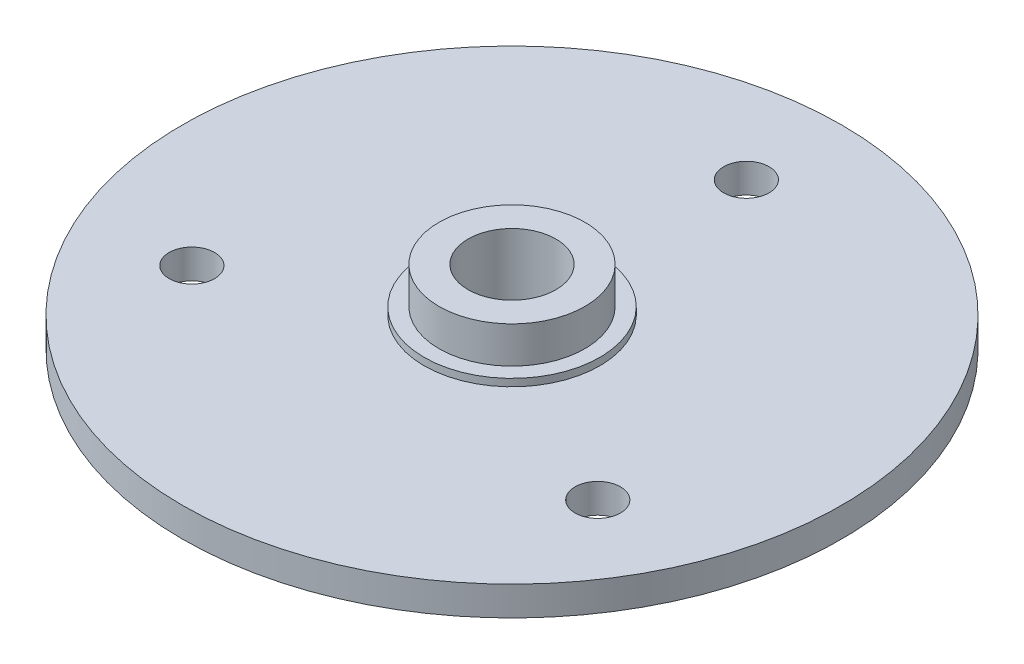
ISO-10303-21;
HEADER;
FILE_DESCRIPTION(('STEP AP214'),'2;1');
FILE_NAME('part.step','',(''),(''),'','','');
FILE_SCHEMA(('AUTOMOTIVE_DESIGN { 1 0 10303 214 1 1 1 1 }'));
ENDSEC;
DATA;
#1=APPLICATION_CONTEXT('core data for automotive mechanical design processes');
#2=APPLICATION_PROTOCOL_DEFINITION('international standard','automotive_design',2000,#1);
#3=PRODUCT_CONTEXT('',#1,'mechanical');
#4=PRODUCT('Part','Part','',(#3));
#5=PRODUCT_RELATED_PRODUCT_CATEGORY('part','',(#4));
#6=PRODUCT_DEFINITION_FORMATION('','',#4);
#7=PRODUCT_DEFINITION_CONTEXT('part definition',#1,'design');
#8=PRODUCT_DEFINITION('design','',#6,#7);
#9=PRODUCT_DEFINITION_SHAPE('','',#8);
#10=(LENGTH_UNIT() NAMED_UNIT(*) SI_UNIT(.MILLI.,.METRE.));
#11=(NAMED_UNIT(*) PLANE_ANGLE_UNIT() SI_UNIT($,.RADIAN.));
#12=(NAMED_UNIT(*) SI_UNIT($,.STERADIAN.) SOLID_ANGLE_UNIT());
#13=UNCERTAINTY_MEASURE_WITH_UNIT(LENGTH_MEASURE(1.E-05),#10,'distance_accuracy_value','');
#14=(GEOMETRIC_REPRESENTATION_CONTEXT(3) GLOBAL_UNCERTAINTY_ASSIGNED_CONTEXT((#13)) GLOBAL_UNIT_ASSIGNED_CONTEXT((#10,
#11,#12)) REPRESENTATION_CONTEXT('',''));
#15=CARTESIAN_POINT('',(0.,0.,0.));
#16=DIRECTION('',(0.,0.,1.));
#17=DIRECTION('',(1.,0.,0.));
#18=AXIS2_PLACEMENT_3D('',#15,#16,#17);
#19=CARTESIAN_POINT('',(0.,2.,0.));
#20=DIRECTION('',(0.,1.,0.));
#21=DIRECTION('',(0.,0.,1.));
#22=AXIS2_PLACEMENT_3D('',#19,#20,#21);
#23=PLANE('',#22);
#24=CARTESIAN_POINT('',(0.,2.,0.));
#25=DIRECTION('',(0.,1.,0.));
#26=DIRECTION('',(0.,0.,1.));
#27=AXIS2_PLACEMENT_3D('',#24,#25,#26);
#28=CIRCLE('',#27,6.);
#29=CARTESIAN_POINT('',(0.,2.,6.));
#30=VERTEX_POINT('',#29);
#31=EDGE_CURVE('E68',#30,#30,#28,.T.);
#32=ORIENTED_EDGE('',*,*,#31,.F.);
#33=EDGE_LOOP('',(#32));
#34=FACE_BOUND('',#33,.T.);
#35=CARTESIAN_POINT('',(13.856406460551,2.,8.));
#36=DIRECTION('',(0.,1.,0.));
#37=DIRECTION('',(0.,0.,1.));
#38=AXIS2_PLACEMENT_3D('',#35,#36,#37);
#39=CIRCLE('',#38,1.55);
#40=CARTESIAN_POINT('',(13.856406460551,2.,9.55));
#41=VERTEX_POINT('',#40);
#42=EDGE_CURVE('E51',#41,#41,#39,.T.);
#43=ORIENTED_EDGE('',*,*,#42,.F.);
#44=EDGE_LOOP('',(#43));
#45=FACE_BOUND('',#44,.T.);
#46=CARTESIAN_POINT('',(0.,2.,0.));
#47=DIRECTION('',(0.,1.,0.));
#48=DIRECTION('',(0.,0.,1.));
#49=AXIS2_PLACEMENT_3D('',#46,#47,#48);
#50=CIRCLE('',#49,22.5);
#51=CARTESIAN_POINT('',(0.,2.,22.5));
#52=VERTEX_POINT('',#51);
#53=EDGE_CURVE('E10',#52,#52,#50,.T.);
#54=ORIENTED_EDGE('',*,*,#53,.T.);
#55=EDGE_LOOP('',(#54));
#56=FACE_BOUND('',#55,.T.);
#57=CARTESIAN_POINT('',(0.,2.,-16.));
#58=DIRECTION('',(0.,1.,0.));
#59=DIRECTION('',(0.,0.,1.));
#60=AXIS2_PLACEMENT_3D('',#57,#58,#59);
#61=CIRCLE('',#60,1.55);
#62=CARTESIAN_POINT('',(0.,2.,-14.45));
#63=VERTEX_POINT('',#62);
#64=EDGE_CURVE('E46',#63,#63,#61,.T.);
#65=ORIENTED_EDGE('',*,*,#64,.F.);
#66=EDGE_LOOP('',(#65));
#67=FACE_BOUND('',#66,.T.);
#68=CARTESIAN_POINT('',(-13.856406460551,2.,8.00000000000001));
#69=DIRECTION('',(0.,1.,0.));
#70=DIRECTION('',(0.,0.,1.));
#71=AXIS2_PLACEMENT_3D('',#68,#69,#70);
#72=CIRCLE('',#71,1.55);
#73=CARTESIAN_POINT('',(-13.856406460551,2.,9.55));
#74=VERTEX_POINT('',#73);
#75=EDGE_CURVE('E57',#74,#74,#72,.T.);
#76=ORIENTED_EDGE('',*,*,#75,.F.);
#77=EDGE_LOOP('',(#76));
#78=FACE_BOUND('',#77,.T.);
#79=ADVANCED_FACE('F33',(#34,#45,#56,#67,#78),#23,.T.);
#80=CARTESIAN_POINT('',(0.,0.,0.));
#81=DIRECTION('',(0.,1.,0.));
#82=DIRECTION('',(0.,0.,1.));
#83=AXIS2_PLACEMENT_3D('',#80,#81,#82);
#84=PLANE('',#83);
#85=CARTESIAN_POINT('',(0.,0.,0.));
#86=DIRECTION('',(0.,1.,0.));
#87=DIRECTION('',(0.,0.,1.));
#88=AXIS2_PLACEMENT_3D('',#85,#86,#87);
#89=CIRCLE('',#88,3.);
#90=CARTESIAN_POINT('',(0.,0.,3.));
#91=VERTEX_POINT('',#90);
#92=EDGE_CURVE('E72',#91,#91,#89,.T.);
#93=ORIENTED_EDGE('',*,*,#92,.T.);
#94=EDGE_LOOP('',(#93));
#95=FACE_BOUND('',#94,.T.);
#96=CARTESIAN_POINT('',(0.,0.,0.));
#97=DIRECTION('',(0.,1.,0.));
#98=DIRECTION('',(0.,0.,1.));
#99=AXIS2_PLACEMENT_3D('',#96,#97,#98);
#100=CIRCLE('',#99,22.5);
#101=CARTESIAN_POINT('',(0.,0.,22.5));
#102=VERTEX_POINT('',#101);
#103=EDGE_CURVE('E41',#102,#102,#100,.T.);
#104=ORIENTED_EDGE('',*,*,#103,.F.);
#105=EDGE_LOOP('',(#104));
#106=FACE_BOUND('',#105,.T.);
#107=CARTESIAN_POINT('',(0.,0.,-16.));
#108=DIRECTION('',(0.,1.,0.));
#109=DIRECTION('',(0.,0.,1.));
#110=AXIS2_PLACEMENT_3D('',#107,#108,#109);
#111=CIRCLE('',#110,1.55);
#112=CARTESIAN_POINT('',(0.,0.,-14.45));
#113=VERTEX_POINT('',#112);
#114=EDGE_CURVE('E48',#113,#113,#111,.T.);
#115=ORIENTED_EDGE('',*,*,#114,.T.);
#116=EDGE_LOOP('',(#115));
#117=FACE_BOUND('',#116,.T.);
#118=CARTESIAN_POINT('',(13.856406460551,0.,8.));
#119=DIRECTION('',(0.,1.,0.));
#120=DIRECTION('',(0.,0.,1.));
#121=AXIS2_PLACEMENT_3D('',#118,#119,#120);
#122=CIRCLE('',#121,1.55);
#123=CARTESIAN_POINT('',(13.856406460551,0.,9.55));
#124=VERTEX_POINT('',#123);
#125=EDGE_CURVE('E54',#124,#124,#122,.T.);
#126=ORIENTED_EDGE('',*,*,#125,.T.);
#127=EDGE_LOOP('',(#126));
#128=FACE_BOUND('',#127,.T.);
#129=CARTESIAN_POINT('',(-13.856406460551,0.,8.00000000000001));
#130=DIRECTION('',(0.,1.,0.));
#131=DIRECTION('',(0.,0.,1.));
#132=AXIS2_PLACEMENT_3D('',#129,#130,#131);
#133=CIRCLE('',#132,1.55);
#134=CARTESIAN_POINT('',(-13.856406460551,0.,9.55));
#135=VERTEX_POINT('',#134);
#136=EDGE_CURVE('E60',#135,#135,#133,.T.);
#137=ORIENTED_EDGE('',*,*,#136,.T.);
#138=EDGE_LOOP('',(#137));
#139=FACE_BOUND('',#138,.T.);
#140=ADVANCED_FACE('F81',(#95,#106,#117,#128,#139),#84,.F.);
#141=CARTESIAN_POINT('',(0.,2.,0.));
#142=DIRECTION('',(0.,-1.,0.));
#143=DIRECTION('',(0.,0.,-1.));
#144=AXIS2_PLACEMENT_3D('',#141,#142,#143);
#145=CYLINDRICAL_SURFACE('',#144,22.5);
#146=ORIENTED_EDGE('',*,*,#53,.F.);
#147=EDGE_LOOP('',(#146));
#148=FACE_BOUND('',#147,.T.);
#149=ORIENTED_EDGE('',*,*,#103,.T.);
#150=EDGE_LOOP('',(#149));
#151=FACE_BOUND('',#150,.T.);
#152=ADVANCED_FACE('F35',(#148,#151),#145,.T.);
#153=CARTESIAN_POINT('',(0.,2.,-16.));
#154=DIRECTION('',(0.,-1.,0.));
#155=DIRECTION('',(0.,0.,-1.));
#156=AXIS2_PLACEMENT_3D('',#153,#154,#155);
#157=CYLINDRICAL_SURFACE('',#156,1.55);
#158=ORIENTED_EDGE('',*,*,#64,.T.);
#159=EDGE_LOOP('',(#158));
#160=FACE_BOUND('',#159,.T.);
#161=ORIENTED_EDGE('',*,*,#114,.F.);
#162=EDGE_LOOP('',(#161));
#163=FACE_BOUND('',#162,.T.);
#164=ADVANCED_FACE('F114',(#160,#163),#157,.F.);
#165=CARTESIAN_POINT('',(13.856406460551,2.,8.));
#166=DIRECTION('',(0.,-1.,0.));
#167=DIRECTION('',(0.,0.,-1.));
#168=AXIS2_PLACEMENT_3D('',#165,#166,#167);
#169=CYLINDRICAL_SURFACE('',#168,1.55);
#170=ORIENTED_EDGE('',*,*,#42,.T.);
#171=EDGE_LOOP('',(#170));
#172=FACE_BOUND('',#171,.T.);
#173=ORIENTED_EDGE('',*,*,#125,.F.);
#174=EDGE_LOOP('',(#173));
#175=FACE_BOUND('',#174,.T.);
#176=ADVANCED_FACE('F117',(#172,#175),#169,.F.);
#177=CARTESIAN_POINT('',(-13.856406460551,2.,8.00000000000001));
#178=DIRECTION('',(0.,-1.,0.));
#179=DIRECTION('',(0.,0.,-1.));
#180=AXIS2_PLACEMENT_3D('',#177,#178,#179);
#181=CYLINDRICAL_SURFACE('',#180,1.55);
#182=ORIENTED_EDGE('',*,*,#75,.T.);
#183=EDGE_LOOP('',(#182));
#184=FACE_BOUND('',#183,.T.);
#185=ORIENTED_EDGE('',*,*,#136,.F.);
#186=EDGE_LOOP('',(#185));
#187=FACE_BOUND('',#186,.T.);
#188=ADVANCED_FACE('F120',(#184,#187),#181,.F.);
#189=CARTESIAN_POINT('',(0.,2.5,0.));
#190=DIRECTION('',(0.,-1.,0.));
#191=DIRECTION('',(0.,0.,-1.));
#192=AXIS2_PLACEMENT_3D('',#189,#190,#191);
#193=CYLINDRICAL_SURFACE('',#192,6.);
#194=CARTESIAN_POINT('',(0.,2.5,0.));
#195=DIRECTION('',(0.,1.,0.));
#196=DIRECTION('',(0.,0.,1.));
#197=AXIS2_PLACEMENT_3D('',#194,#195,#196);
#198=CIRCLE('',#197,6.);
#199=CARTESIAN_POINT('',(0.,2.5,6.));
#200=VERTEX_POINT('',#199);
#201=EDGE_CURVE('E71',#200,#200,#198,.T.);
#202=ORIENTED_EDGE('',*,*,#201,.F.);
#203=EDGE_LOOP('',(#202));
#204=FACE_BOUND('',#203,.T.);
#205=ORIENTED_EDGE('',*,*,#31,.T.);
#206=EDGE_LOOP('',(#205));
#207=FACE_BOUND('',#206,.T.);
#208=ADVANCED_FACE('F123',(#204,#207),#193,.T.);
#209=CARTESIAN_POINT('',(0.,2.5,0.));
#210=DIRECTION('',(0.,1.,0.));
#211=DIRECTION('',(0.,0.,1.));
#212=AXIS2_PLACEMENT_3D('',#209,#210,#211);
#213=PLANE('',#212);
#214=CARTESIAN_POINT('',(0.,2.5,0.));
#215=DIRECTION('',(0.,1.,0.));
#216=DIRECTION('',(0.,0.,1.));
#217=AXIS2_PLACEMENT_3D('',#214,#215,#216);
#218=CIRCLE('',#217,4.98);
#219=CARTESIAN_POINT('',(0.,2.5,4.98));
#220=VERTEX_POINT('',#219);
#221=EDGE_CURVE('E37',#220,#220,#218,.T.);
#222=ORIENTED_EDGE('',*,*,#221,.F.);
#223=EDGE_LOOP('',(#222));
#224=FACE_BOUND('',#223,.T.);
#225=ORIENTED_EDGE('',*,*,#201,.T.);
#226=EDGE_LOOP('',(#225));
#227=FACE_BOUND('',#226,.T.);
#228=ADVANCED_FACE('F94',(#224,#227),#213,.T.);
#229=CARTESIAN_POINT('',(0.,5.,0.));
#230=DIRECTION('',(0.,1.,0.));
#231=DIRECTION('',(0.,0.,1.));
#232=AXIS2_PLACEMENT_3D('',#229,#230,#231);
#233=PLANE('',#232);
#234=CARTESIAN_POINT('',(0.,5.,0.));
#235=DIRECTION('',(0.,1.,0.));
#236=DIRECTION('',(0.,0.,1.));
#237=AXIS2_PLACEMENT_3D('',#234,#235,#236);
#238=CIRCLE('',#237,3.);
#239=CARTESIAN_POINT('',(0.,5.,3.));
#240=VERTEX_POINT('',#239);
#241=EDGE_CURVE('E75',#240,#240,#238,.T.);
#242=ORIENTED_EDGE('',*,*,#241,.F.);
#243=EDGE_LOOP('',(#242));
#244=FACE_BOUND('',#243,.T.);
#245=CARTESIAN_POINT('',(0.,5.,0.));
#246=DIRECTION('',(0.,1.,0.));
#247=DIRECTION('',(0.,0.,1.));
#248=AXIS2_PLACEMENT_3D('',#245,#246,#247);
#249=CIRCLE('',#248,4.98);
#250=CARTESIAN_POINT('',(0.,5.,4.98));
#251=VERTEX_POINT('',#250);
#252=EDGE_CURVE('E63',#251,#251,#249,.T.);
#253=ORIENTED_EDGE('',*,*,#252,.T.);
#254=EDGE_LOOP('',(#253));
#255=FACE_BOUND('',#254,.T.);
#256=ADVANCED_FACE('F91',(#244,#255),#233,.T.);
#257=CARTESIAN_POINT('',(0.,5.,0.));
#258=DIRECTION('',(0.,-1.,0.));
#259=DIRECTION('',(0.,0.,-1.));
#260=AXIS2_PLACEMENT_3D('',#257,#258,#259);
#261=CYLINDRICAL_SURFACE('',#260,4.98);
#262=ORIENTED_EDGE('',*,*,#221,.T.);
#263=EDGE_LOOP('',(#262));
#264=FACE_BOUND('',#263,.T.);
#265=ORIENTED_EDGE('',*,*,#252,.F.);
#266=EDGE_LOOP('',(#265));
#267=FACE_BOUND('',#266,.T.);
#268=ADVANCED_FACE('F87',(#264,#267),#261,.T.);
#269=CARTESIAN_POINT('',(0.,0.,0.));
#270=DIRECTION('',(0.,1.,0.));
#271=DIRECTION('',(0.,0.,1.));
#272=AXIS2_PLACEMENT_3D('',#269,#270,#271);
#273=CYLINDRICAL_SURFACE('',#272,3.);
#274=ORIENTED_EDGE('',*,*,#92,.F.);
#275=EDGE_LOOP('',(#274));
#276=FACE_BOUND('',#275,.T.);
#277=ORIENTED_EDGE('',*,*,#241,.T.);
#278=EDGE_LOOP('',(#277));
#279=FACE_BOUND('',#278,.T.);
#280=ADVANCED_FACE('F84',(#276,#279),#273,.F.);
#281=CLOSED_SHELL('',(#79,#140,#152,#164,#176,#188,#208,#228,#256,#268,#280));
#282=MANIFOLD_SOLID_BREP('B2',#281);
#283=ADVANCED_BREP_SHAPE_REPRESENTATION('',(#18,#282),#14);
#284=SHAPE_DEFINITION_REPRESENTATION(#9,#283);
ENDSEC;
END-ISO-10303-21;
